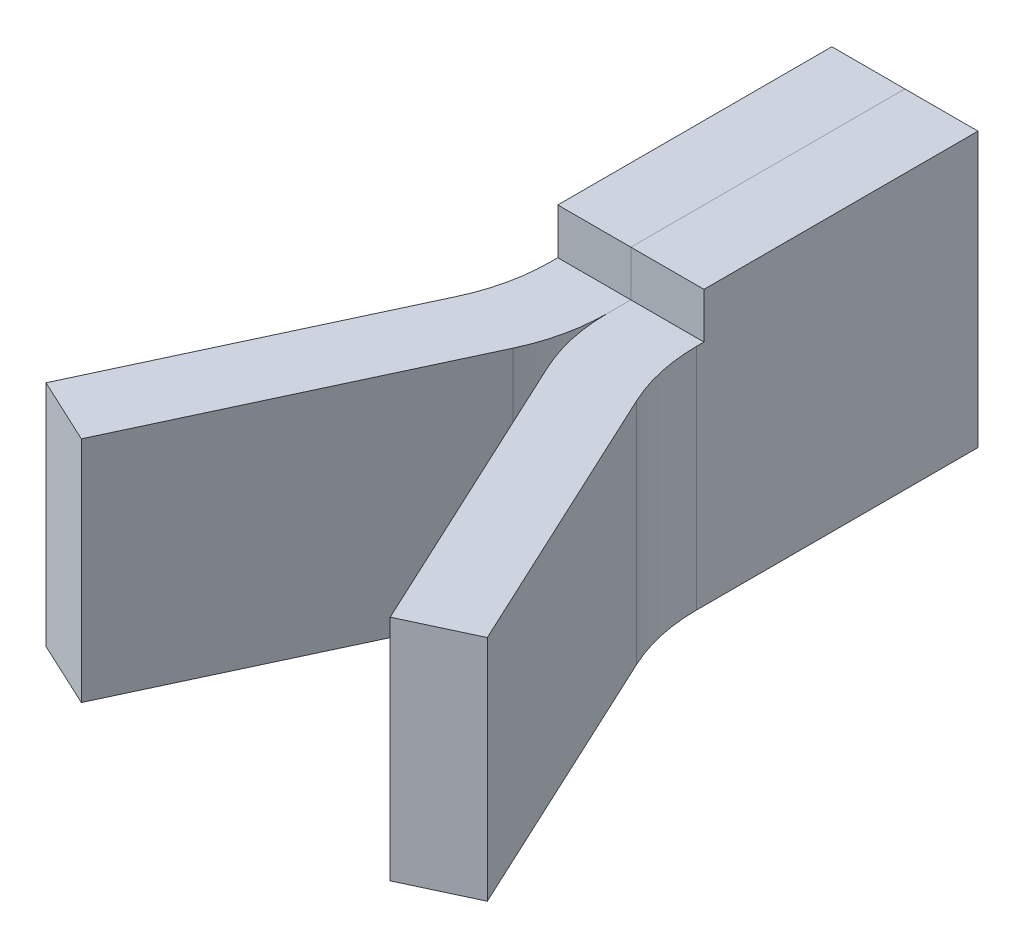
ISO-10303-21;
HEADER;
FILE_DESCRIPTION(('STEP AP214'),'2;1');
FILE_NAME('part.step','',(''),(''),'','','');
FILE_SCHEMA(('AUTOMOTIVE_DESIGN { 1 0 10303 214 1 1 1 1 }'));
ENDSEC;
DATA;
#1=APPLICATION_CONTEXT('core data for automotive mechanical design processes');
#2=APPLICATION_PROTOCOL_DEFINITION('international standard','automotive_design',2000,#1);
#3=PRODUCT_CONTEXT('',#1,'mechanical');
#4=PRODUCT('Part','Part','',(#3));
#5=PRODUCT_RELATED_PRODUCT_CATEGORY('part','',(#4));
#6=PRODUCT_DEFINITION_FORMATION('','',#4);
#7=PRODUCT_DEFINITION_CONTEXT('part definition',#1,'design');
#8=PRODUCT_DEFINITION('design','',#6,#7);
#9=PRODUCT_DEFINITION_SHAPE('','',#8);
#10=(LENGTH_UNIT() NAMED_UNIT(*) SI_UNIT(.MILLI.,.METRE.));
#11=(NAMED_UNIT(*) PLANE_ANGLE_UNIT() SI_UNIT($,.RADIAN.));
#12=(NAMED_UNIT(*) SI_UNIT($,.STERADIAN.) SOLID_ANGLE_UNIT());
#13=UNCERTAINTY_MEASURE_WITH_UNIT(LENGTH_MEASURE(1.E-05),#10,'distance_accuracy_value','');
#14=(GEOMETRIC_REPRESENTATION_CONTEXT(3) GLOBAL_UNCERTAINTY_ASSIGNED_CONTEXT((#13)) GLOBAL_UNIT_ASSIGNED_CONTEXT((#10,
#11,#12)) REPRESENTATION_CONTEXT('',''));
#15=CARTESIAN_POINT('',(0.,0.,0.));
#16=DIRECTION('',(0.,0.,1.));
#17=DIRECTION('',(1.,0.,0.));
#18=AXIS2_PLACEMENT_3D('',#15,#16,#17);
#19=CARTESIAN_POINT('',(-16.904730469628,25.,36.252311481466));
#20=DIRECTION('',(-0.906307787036649,0.,-0.422618261740701));
#21=DIRECTION('',(0.422618261740701,0.,-0.906307787036649));
#22=AXIS2_PLACEMENT_3D('',#19,#20,#21);
#23=PLANE('',#22);
#24=DIRECTION('',(-0.422618261740701,0.,0.906307787036649));
#25=VECTOR('',#24,1.);
#26=CARTESIAN_POINT('',(-16.904730469628,25.,36.252311481466));
#27=LINE('',#26,#25);
#28=CARTESIAN_POINT('',(-1.87384425926702,25.,4.01847198195521));
#29=VERTEX_POINT('',#28);
#30=CARTESIAN_POINT('',(-16.904730469628,25.,36.252311481466));
#31=VERTEX_POINT('',#30);
#32=EDGE_CURVE('E160',#29,#31,#27,.T.);
#33=ORIENTED_EDGE('',*,*,#32,.T.);
#34=DIRECTION('',(0.,-1.,0.));
#35=VECTOR('',#34,1.);
#36=CARTESIAN_POINT('',(-16.904730469628,25.,36.252311481466));
#37=LINE('',#36,#35);
#38=CARTESIAN_POINT('',(-16.904730469628,0.,36.252311481466));
#39=VERTEX_POINT('',#38);
#40=EDGE_CURVE('E191',#31,#39,#37,.T.);
#41=ORIENTED_EDGE('',*,*,#40,.T.);
#42=DIRECTION('',(-0.422618261740701,0.,0.906307787036649));
#43=VECTOR('',#42,1.);
#44=CARTESIAN_POINT('',(-16.904730469628,0.,36.252311481466));
#45=LINE('',#44,#43);
#46=CARTESIAN_POINT('',(-1.87384425926702,0.,4.01847198195521));
#47=VERTEX_POINT('',#46);
#48=EDGE_CURVE('E159',#47,#39,#45,.T.);
#49=ORIENTED_EDGE('',*,*,#48,.F.);
#50=DIRECTION('',(0.,-1.,0.));
#51=VECTOR('',#50,1.);
#52=CARTESIAN_POINT('',(-1.87384425926701,25.,4.01847198195521));
#53=LINE('',#52,#51);
#54=EDGE_CURVE('E194',#29,#47,#53,.T.);
#55=ORIENTED_EDGE('',*,*,#54,.F.);
#56=EDGE_LOOP('',(#33,#41,#49,#55));
#57=FACE_BOUND('',#56,.T.);
#58=ADVANCED_FACE('F47',(#57),#23,.F.);
#59=CARTESIAN_POINT('',(-24.1551927659212,25.,32.8713653875404));
#60=DIRECTION('',(0.422618261740701,0.,-0.906307787036649));
#61=DIRECTION('',(0.906307787036649,0.,0.422618261740701));
#62=AXIS2_PLACEMENT_3D('',#59,#60,#61);
#63=PLANE('',#62);
#64=DIRECTION('',(-0.906307787036649,0.,-0.422618261740701));
#65=VECTOR('',#64,1.);
#66=CARTESIAN_POINT('',(-24.1551927659212,0.,32.8713653875404));
#67=LINE('',#66,#65);
#68=CARTESIAN_POINT('',(-24.1551927659212,0.,32.8713653875404));
#69=VERTEX_POINT('',#68);
#70=EDGE_CURVE('E177',#39,#69,#67,.T.);
#71=ORIENTED_EDGE('',*,*,#70,.F.);
#72=ORIENTED_EDGE('',*,*,#40,.F.);
#73=DIRECTION('',(-0.906307787036649,0.,-0.422618261740701));
#74=VECTOR('',#73,1.);
#75=CARTESIAN_POINT('',(-24.1551927659212,25.,32.8713653875404));
#76=LINE('',#75,#74);
#77=CARTESIAN_POINT('',(-24.1551927659212,25.,32.8713653875404));
#78=VERTEX_POINT('',#77);
#79=EDGE_CURVE('E163',#31,#78,#76,.T.);
#80=ORIENTED_EDGE('',*,*,#79,.T.);
#81=DIRECTION('',(0.,-1.,0.));
#82=VECTOR('',#81,1.);
#83=CARTESIAN_POINT('',(-24.1551927659212,25.,32.8713653875404));
#84=LINE('',#83,#82);
#85=EDGE_CURVE('E141',#78,#69,#84,.T.);
#86=ORIENTED_EDGE('',*,*,#85,.T.);
#87=EDGE_LOOP('',(#71,#72,#80,#86));
#88=FACE_BOUND('',#87,.T.);
#89=ADVANCED_FACE('F216',(#88),#63,.F.);
#90=CARTESIAN_POINT('',(-8.,25.,-1.77355730114351));
#91=DIRECTION('',(0.906307787036649,0.,0.422618261740701));
#92=DIRECTION('',(-0.422618261740701,0.,0.906307787036649));
#93=AXIS2_PLACEMENT_3D('',#90,#91,#92);
#94=PLANE('',#93);
#95=DIRECTION('',(0.422618261740701,0.,-0.906307787036649));
#96=VECTOR('',#95,1.);
#97=CARTESIAN_POINT('',(-8.,0.,-1.77355730114351));
#98=LINE('',#97,#96);
#99=CARTESIAN_POINT('',(-9.87384425926702,0.,2.24491468081169));
#100=VERTEX_POINT('',#99);
#101=EDGE_CURVE('E180',#69,#100,#98,.T.);
#102=ORIENTED_EDGE('',*,*,#101,.F.);
#103=ORIENTED_EDGE('',*,*,#85,.F.);
#104=DIRECTION('',(0.422618261740701,0.,-0.906307787036649));
#105=VECTOR('',#104,1.);
#106=CARTESIAN_POINT('',(-8.,25.,-1.77355730114351));
#107=LINE('',#106,#105);
#108=CARTESIAN_POINT('',(-9.87384425926702,25.,2.24491468081169));
#109=VERTEX_POINT('',#108);
#110=EDGE_CURVE('E167',#78,#109,#107,.T.);
#111=ORIENTED_EDGE('',*,*,#110,.T.);
#112=DIRECTION('',(0.,-1.,0.));
#113=VECTOR('',#112,1.);
#114=CARTESIAN_POINT('',(-9.87384425926702,25.,2.24491468081169));
#115=LINE('',#114,#113);
#116=EDGE_CURVE('E206',#100,#109,#115,.F.);
#117=ORIENTED_EDGE('',*,*,#116,.F.);
#118=EDGE_LOOP('',(#102,#103,#111,#117));
#119=FACE_BOUND('',#118,.T.);
#120=ADVANCED_FACE('F210',(#119),#94,.F.);
#121=CARTESIAN_POINT('',(-8.,25.,-37.));
#122=DIRECTION('',(1.,0.,0.));
#123=DIRECTION('',(0.,0.,1.));
#124=AXIS2_PLACEMENT_3D('',#121,#122,#123);
#125=PLANE('',#124);
#126=DIRECTION('',(0.,0.,-1.));
#127=VECTOR('',#126,1.);
#128=CARTESIAN_POINT('',(-8.,25.,-37.));
#129=LINE('',#128,#127);
#130=CARTESIAN_POINT('',(-8.,25.,-6.20745055400233));
#131=VERTEX_POINT('',#130);
#132=CARTESIAN_POINT('',(-8.00000000000002,25.,-7.));
#133=VERTEX_POINT('',#132);
#134=EDGE_CURVE('E170',#131,#133,#129,.T.);
#135=ORIENTED_EDGE('',*,*,#134,.T.);
#136=DIRECTION('',(0.,-1.,0.));
#137=VECTOR('',#136,1.);
#138=CARTESIAN_POINT('',(-8.00000000000002,30.,-7.));
#139=LINE('',#138,#137);
#140=CARTESIAN_POINT('',(-8.00000000000002,30.,-7.));
#141=VERTEX_POINT('',#140);
#142=EDGE_CURVE('E147',#141,#133,#139,.T.);
#143=ORIENTED_EDGE('',*,*,#142,.F.);
#144=DIRECTION('',(0.,0.,-1.));
#145=VECTOR('',#144,1.);
#146=CARTESIAN_POINT('',(-8.,30.,-37.));
#147=LINE('',#146,#145);
#148=CARTESIAN_POINT('',(-8.,30.,-37.));
#149=VERTEX_POINT('',#148);
#150=EDGE_CURVE('E125',#141,#149,#147,.T.);
#151=ORIENTED_EDGE('',*,*,#150,.T.);
#152=DIRECTION('',(0.,-1.,0.));
#153=VECTOR('',#152,1.);
#154=CARTESIAN_POINT('',(-8.,25.,-37.));
#155=LINE('',#154,#153);
#156=CARTESIAN_POINT('',(-8.,0.,-37.));
#157=VERTEX_POINT('',#156);
#158=EDGE_CURVE('E134',#149,#157,#155,.T.);
#159=ORIENTED_EDGE('',*,*,#158,.T.);
#160=DIRECTION('',(0.,0.,-1.));
#161=VECTOR('',#160,1.);
#162=CARTESIAN_POINT('',(-8.,0.,-37.));
#163=LINE('',#162,#161);
#164=CARTESIAN_POINT('',(-8.,0.,-6.20745055400233));
#165=VERTEX_POINT('',#164);
#166=EDGE_CURVE('E183',#165,#157,#163,.T.);
#167=ORIENTED_EDGE('',*,*,#166,.F.);
#168=DIRECTION('',(0.,-1.,0.));
#169=VECTOR('',#168,1.);
#170=CARTESIAN_POINT('',(-8.,0.,-6.20745055400233));
#171=LINE('',#170,#169);
#172=EDGE_CURVE('E204',#131,#165,#171,.T.);
#173=ORIENTED_EDGE('',*,*,#172,.F.);
#174=EDGE_LOOP('',(#135,#143,#151,#159,#167,#173));
#175=FACE_BOUND('',#174,.T.);
#176=ADVANCED_FACE('F145',(#175),#125,.F.);
#177=CARTESIAN_POINT('',(0.,25.,-37.));
#178=DIRECTION('',(0.,0.,1.));
#179=DIRECTION('',(-1.,0.,0.));
#180=AXIS2_PLACEMENT_3D('',#177,#178,#179);
#181=PLANE('',#180);
#182=DIRECTION('',(1.,0.,0.));
#183=VECTOR('',#182,1.);
#184=CARTESIAN_POINT('',(0.,0.,-37.));
#185=LINE('',#184,#183);
#186=CARTESIAN_POINT('',(0.,0.,-37.));
#187=VERTEX_POINT('',#186);
#188=EDGE_CURVE('E137',#157,#187,#185,.T.);
#189=ORIENTED_EDGE('',*,*,#188,.F.);
#190=ORIENTED_EDGE('',*,*,#158,.F.);
#191=DIRECTION('',(1.,0.,0.));
#192=VECTOR('',#191,1.);
#193=CARTESIAN_POINT('',(-8.,30.,-37.));
#194=LINE('',#193,#192);
#195=CARTESIAN_POINT('',(0.,30.,-37.));
#196=VERTEX_POINT('',#195);
#197=EDGE_CURVE('E121',#149,#196,#194,.T.);
#198=ORIENTED_EDGE('',*,*,#197,.T.);
#199=DIRECTION('',(0.,-1.,0.));
#200=VECTOR('',#199,1.);
#201=CARTESIAN_POINT('',(0.,25.,-37.));
#202=LINE('',#201,#200);
#203=EDGE_CURVE('E142',#196,#187,#202,.T.);
#204=ORIENTED_EDGE('',*,*,#203,.T.);
#205=EDGE_LOOP('',(#189,#190,#198,#204));
#206=FACE_BOUND('',#205,.T.);
#207=ADVANCED_FACE('F135',(#206),#181,.F.);
#208=CARTESIAN_POINT('',(0.,25.,0.));
#209=DIRECTION('',(-1.,0.,0.));
#210=DIRECTION('',(0.,0.,-1.));
#211=AXIS2_PLACEMENT_3D('',#208,#209,#210);
#212=PLANE('',#211);
#213=DIRECTION('',(0.,0.,1.));
#214=VECTOR('',#213,1.);
#215=CARTESIAN_POINT('',(0.,0.,0.));
#216=LINE('',#215,#214);
#217=CARTESIAN_POINT('',(0.,0.,-4.43389325285881));
#218=VERTEX_POINT('',#217);
#219=EDGE_CURVE('E164',#187,#218,#216,.T.);
#220=ORIENTED_EDGE('',*,*,#219,.F.);
#221=ORIENTED_EDGE('',*,*,#203,.F.);
#222=DIRECTION('',(0.,0.,1.));
#223=VECTOR('',#222,1.);
#224=CARTESIAN_POINT('',(0.,30.,-37.));
#225=LINE('',#224,#223);
#226=CARTESIAN_POINT('',(0.,30.,-7.));
#227=VERTEX_POINT('',#226);
#228=EDGE_CURVE('E128',#196,#227,#225,.T.);
#229=ORIENTED_EDGE('',*,*,#228,.T.);
#230=DIRECTION('',(0.,-1.,0.));
#231=VECTOR('',#230,1.);
#232=CARTESIAN_POINT('',(0.,30.,-7.));
#233=LINE('',#232,#231);
#234=CARTESIAN_POINT('',(0.,25.,-7.));
#235=VERTEX_POINT('',#234);
#236=EDGE_CURVE('E156',#227,#235,#233,.T.);
#237=ORIENTED_EDGE('',*,*,#236,.T.);
#238=DIRECTION('',(0.,0.,1.));
#239=VECTOR('',#238,1.);
#240=CARTESIAN_POINT('',(0.,25.,0.));
#241=LINE('',#240,#239);
#242=CARTESIAN_POINT('',(0.,25.,-4.43389325285881));
#243=VERTEX_POINT('',#242);
#244=EDGE_CURVE('E172',#235,#243,#241,.T.);
#245=ORIENTED_EDGE('',*,*,#244,.T.);
#246=DIRECTION('',(0.,-1.,0.));
#247=VECTOR('',#246,1.);
#248=CARTESIAN_POINT('',(0.,25.,-4.43389325285881));
#249=LINE('',#248,#247);
#250=EDGE_CURVE('E199',#218,#243,#249,.F.);
#251=ORIENTED_EDGE('',*,*,#250,.F.);
#252=EDGE_LOOP('',(#220,#221,#229,#237,#245,#251));
#253=FACE_BOUND('',#252,.T.);
#254=ADVANCED_FACE('F226',(#253),#212,.F.);
#255=CARTESIAN_POINT('',(0.,25.,0.));
#256=DIRECTION('',(0.,1.,0.));
#257=DIRECTION('',(0.,0.,1.));
#258=AXIS2_PLACEMENT_3D('',#255,#256,#257);
#259=PLANE('',#258);
#260=ORIENTED_EDGE('',*,*,#244,.F.);
#261=DIRECTION('',(-1.,0.,0.));
#262=VECTOR('',#261,1.);
#263=CARTESIAN_POINT('',(-8.00000000000002,25.,-7.));
#264=LINE('',#263,#262);
#265=EDGE_CURVE('E148',#235,#133,#264,.T.);
#266=ORIENTED_EDGE('',*,*,#265,.T.);
#267=ORIENTED_EDGE('',*,*,#134,.F.);
#268=CARTESIAN_POINT('',(-28.,25.,-6.20745055400233));
#269=DIRECTION('',(0.,-1.,0.));
#270=DIRECTION('',(0.,0.,1.));
#271=AXIS2_PLACEMENT_3D('',#268,#269,#270);
#272=CIRCLE('',#271,20.);
#273=EDGE_CURVE('E12',#109,#131,#272,.F.);
#274=ORIENTED_EDGE('',*,*,#273,.F.);
#275=ORIENTED_EDGE('',*,*,#110,.F.);
#276=ORIENTED_EDGE('',*,*,#79,.F.);
#277=ORIENTED_EDGE('',*,*,#32,.F.);
#278=CARTESIAN_POINT('',(-20.,25.,-4.43389325285881));
#279=DIRECTION('',(0.,-1.,0.));
#280=DIRECTION('',(0.,0.,1.));
#281=AXIS2_PLACEMENT_3D('',#278,#279,#280);
#282=CIRCLE('',#281,20.);
#283=EDGE_CURVE('E202',#243,#29,#282,.T.);
#284=ORIENTED_EDGE('',*,*,#283,.F.);
#285=EDGE_LOOP('',(#260,#266,#267,#274,#275,#276,#277,#284));
#286=FACE_BOUND('',#285,.T.);
#287=ADVANCED_FACE('F219',(#286),#259,.T.);
#288=CARTESIAN_POINT('',(0.,0.,0.));
#289=DIRECTION('',(0.,1.,0.));
#290=DIRECTION('',(0.,0.,1.));
#291=AXIS2_PLACEMENT_3D('',#288,#289,#290);
#292=PLANE('',#291);
#293=ORIENTED_EDGE('',*,*,#48,.T.);
#294=ORIENTED_EDGE('',*,*,#70,.T.);
#295=ORIENTED_EDGE('',*,*,#101,.T.);
#296=CARTESIAN_POINT('',(-28.,0.,-6.20745055400233));
#297=DIRECTION('',(0.,-1.,0.));
#298=DIRECTION('',(0.,0.,1.));
#299=AXIS2_PLACEMENT_3D('',#296,#297,#298);
#300=CIRCLE('',#299,20.);
#301=EDGE_CURVE('E55',#165,#100,#300,.T.);
#302=ORIENTED_EDGE('',*,*,#301,.F.);
#303=ORIENTED_EDGE('',*,*,#166,.T.);
#304=ORIENTED_EDGE('',*,*,#188,.T.);
#305=ORIENTED_EDGE('',*,*,#219,.T.);
#306=CARTESIAN_POINT('',(-20.,0.,-4.43389325285881));
#307=DIRECTION('',(0.,-1.,0.));
#308=DIRECTION('',(0.,0.,1.));
#309=AXIS2_PLACEMENT_3D('',#306,#307,#308);
#310=CIRCLE('',#309,20.);
#311=EDGE_CURVE('E197',#47,#218,#310,.F.);
#312=ORIENTED_EDGE('',*,*,#311,.F.);
#313=EDGE_LOOP('',(#293,#294,#295,#302,#303,#304,#305,#312));
#314=FACE_BOUND('',#313,.T.);
#315=ADVANCED_FACE('F212',(#314),#292,.F.);
#316=CARTESIAN_POINT('',(-8.00000000000002,30.,-7.));
#317=DIRECTION('',(0.,0.,-1.));
#318=DIRECTION('',(1.,0.,0.));
#319=AXIS2_PLACEMENT_3D('',#316,#317,#318);
#320=PLANE('',#319);
#321=ORIENTED_EDGE('',*,*,#265,.F.);
#322=ORIENTED_EDGE('',*,*,#236,.F.);
#323=DIRECTION('',(-1.,0.,0.));
#324=VECTOR('',#323,1.);
#325=CARTESIAN_POINT('',(-8.00000000000002,30.,-7.));
#326=LINE('',#325,#324);
#327=EDGE_CURVE('E153',#227,#141,#326,.T.);
#328=ORIENTED_EDGE('',*,*,#327,.T.);
#329=ORIENTED_EDGE('',*,*,#142,.T.);
#330=EDGE_LOOP('',(#321,#322,#328,#329));
#331=FACE_BOUND('',#330,.T.);
#332=ADVANCED_FACE('F229',(#331),#320,.F.);
#333=CARTESIAN_POINT('',(0.,30.,0.));
#334=DIRECTION('',(0.,-1.,0.));
#335=DIRECTION('',(0.,0.,-1.));
#336=AXIS2_PLACEMENT_3D('',#333,#334,#335);
#337=PLANE('',#336);
#338=ORIENTED_EDGE('',*,*,#150,.F.);
#339=ORIENTED_EDGE('',*,*,#327,.F.);
#340=ORIENTED_EDGE('',*,*,#228,.F.);
#341=ORIENTED_EDGE('',*,*,#197,.F.);
#342=EDGE_LOOP('',(#338,#339,#340,#341));
#343=FACE_BOUND('',#342,.T.);
#344=ADVANCED_FACE('F123',(#343),#337,.F.);
#345=CARTESIAN_POINT('',(-20.,25.,-4.43389325285881));
#346=DIRECTION('',(0.,-1.,0.));
#347=DIRECTION('',(0.,0.,-1.));
#348=AXIS2_PLACEMENT_3D('',#345,#346,#347);
#349=CYLINDRICAL_SURFACE('',#348,20.);
#350=ORIENTED_EDGE('',*,*,#283,.T.);
#351=ORIENTED_EDGE('',*,*,#54,.T.);
#352=ORIENTED_EDGE('',*,*,#311,.T.);
#353=ORIENTED_EDGE('',*,*,#250,.T.);
#354=EDGE_LOOP('',(#350,#351,#352,#353));
#355=FACE_BOUND('',#354,.T.);
#356=ADVANCED_FACE('F223',(#355),#349,.T.);
#357=CARTESIAN_POINT('',(-28.,25.,-6.20745055400233));
#358=DIRECTION('',(0.,1.,0.));
#359=DIRECTION('',(0.,0.,1.));
#360=AXIS2_PLACEMENT_3D('',#357,#358,#359);
#361=CYLINDRICAL_SURFACE('',#360,20.);
#362=ORIENTED_EDGE('',*,*,#273,.T.);
#363=ORIENTED_EDGE('',*,*,#172,.T.);
#364=ORIENTED_EDGE('',*,*,#301,.T.);
#365=ORIENTED_EDGE('',*,*,#116,.T.);
#366=EDGE_LOOP('',(#362,#363,#364,#365));
#367=FACE_BOUND('',#366,.T.);
#368=ADVANCED_FACE('F49',(#367),#361,.F.);
#369=CLOSED_SHELL('',(#58,#89,#120,#176,#207,#254,#287,#315,#332,#344,#356,#368));
#370=MANIFOLD_SOLID_BREP('B2',#369);
#371=CARTESIAN_POINT('',(16.904730469628,25.,36.252311481466));
#372=DIRECTION('',(0.906307787036649,0.,-0.422618261740701));
#373=DIRECTION('',(-0.422618261740701,0.,-0.906307787036649));
#374=AXIS2_PLACEMENT_3D('',#371,#372,#373);
#375=PLANE('',#374);
#376=DIRECTION('',(0.422618261740701,0.,0.906307787036649));
#377=VECTOR('',#376,1.);
#378=CARTESIAN_POINT('',(16.904730469628,25.,36.252311481466));
#379=LINE('',#378,#377);
#380=CARTESIAN_POINT('',(1.87384425926702,25.,4.01847198195521));
#381=VERTEX_POINT('',#380);
#382=CARTESIAN_POINT('',(16.904730469628,25.,36.252311481466));
#383=VERTEX_POINT('',#382);
#384=EDGE_CURVE('E452',#381,#383,#379,.T.);
#385=ORIENTED_EDGE('',*,*,#384,.F.);
#386=DIRECTION('',(0.,-1.,0.));
#387=VECTOR('',#386,1.);
#388=CARTESIAN_POINT('',(1.87384425926701,25.,4.01847198195521));
#389=LINE('',#388,#387);
#390=CARTESIAN_POINT('',(1.87384425926702,0.,4.01847198195521));
#391=VERTEX_POINT('',#390);
#392=EDGE_CURVE('E480',#381,#391,#389,.T.);
#393=ORIENTED_EDGE('',*,*,#392,.T.);
#394=DIRECTION('',(0.422618261740701,0.,0.906307787036649));
#395=VECTOR('',#394,1.);
#396=CARTESIAN_POINT('',(16.904730469628,0.,36.252311481466));
#397=LINE('',#396,#395);
#398=CARTESIAN_POINT('',(16.904730469628,0.,36.252311481466));
#399=VERTEX_POINT('',#398);
#400=EDGE_CURVE('E451',#391,#399,#397,.T.);
#401=ORIENTED_EDGE('',*,*,#400,.T.);
#402=DIRECTION('',(0.,-1.,0.));
#403=VECTOR('',#402,1.);
#404=CARTESIAN_POINT('',(16.904730469628,25.,36.252311481466));
#405=LINE('',#404,#403);
#406=EDGE_CURVE('E477',#383,#399,#405,.T.);
#407=ORIENTED_EDGE('',*,*,#406,.F.);
#408=EDGE_LOOP('',(#385,#393,#401,#407));
#409=FACE_BOUND('',#408,.T.);
#410=ADVANCED_FACE('F336',(#409),#375,.F.);
#411=CARTESIAN_POINT('',(24.1551927659212,25.,32.8713653875404));
#412=DIRECTION('',(-0.422618261740701,0.,-0.906307787036649));
#413=DIRECTION('',(-0.906307787036649,0.,0.422618261740701));
#414=AXIS2_PLACEMENT_3D('',#411,#412,#413);
#415=PLANE('',#414);
#416=DIRECTION('',(0.906307787036649,0.,-0.422618261740701));
#417=VECTOR('',#416,1.);
#418=CARTESIAN_POINT('',(24.1551927659212,0.,32.8713653875404));
#419=LINE('',#418,#417);
#420=CARTESIAN_POINT('',(24.1551927659212,0.,32.8713653875404));
#421=VERTEX_POINT('',#420);
#422=EDGE_CURVE('E465',#399,#421,#419,.T.);
#423=ORIENTED_EDGE('',*,*,#422,.T.);
#424=DIRECTION('',(0.,-1.,0.));
#425=VECTOR('',#424,1.);
#426=CARTESIAN_POINT('',(24.1551927659212,25.,32.8713653875404));
#427=LINE('',#426,#425);
#428=CARTESIAN_POINT('',(24.1551927659212,25.,32.8713653875404));
#429=VERTEX_POINT('',#428);
#430=EDGE_CURVE('E424',#429,#421,#427,.T.);
#431=ORIENTED_EDGE('',*,*,#430,.F.);
#432=DIRECTION('',(0.906307787036649,0.,-0.422618261740701));
#433=VECTOR('',#432,1.);
#434=CARTESIAN_POINT('',(24.1551927659212,25.,32.8713653875404));
#435=LINE('',#434,#433);
#436=EDGE_CURVE('E454',#383,#429,#435,.T.);
#437=ORIENTED_EDGE('',*,*,#436,.F.);
#438=ORIENTED_EDGE('',*,*,#406,.T.);
#439=EDGE_LOOP('',(#423,#431,#437,#438));
#440=FACE_BOUND('',#439,.T.);
#441=ADVANCED_FACE('F518',(#440),#415,.F.);
#442=CARTESIAN_POINT('',(8.,25.,-1.77355730114351));
#443=DIRECTION('',(-0.906307787036649,0.,0.422618261740701));
#444=DIRECTION('',(0.422618261740701,0.,0.906307787036649));
#445=AXIS2_PLACEMENT_3D('',#442,#443,#444);
#446=PLANE('',#445);
#447=DIRECTION('',(-0.422618261740701,0.,-0.906307787036649));
#448=VECTOR('',#447,1.);
#449=CARTESIAN_POINT('',(8.,0.,-1.77355730114351));
#450=LINE('',#449,#448);
#451=CARTESIAN_POINT('',(9.87384425926702,0.,2.24491468081169));
#452=VERTEX_POINT('',#451);
#453=EDGE_CURVE('E467',#421,#452,#450,.T.);
#454=ORIENTED_EDGE('',*,*,#453,.T.);
#455=DIRECTION('',(0.,-1.,0.));
#456=VECTOR('',#455,1.);
#457=CARTESIAN_POINT('',(9.87384425926702,25.,2.24491468081169));
#458=LINE('',#457,#456);
#459=CARTESIAN_POINT('',(9.87384425926702,25.,2.24491468081169));
#460=VERTEX_POINT('',#459);
#461=EDGE_CURVE('E357',#452,#460,#458,.F.);
#462=ORIENTED_EDGE('',*,*,#461,.T.);
#463=DIRECTION('',(-0.422618261740701,0.,-0.906307787036649));
#464=VECTOR('',#463,1.);
#465=CARTESIAN_POINT('',(8.,25.,-1.77355730114351));
#466=LINE('',#465,#464);
#467=EDGE_CURVE('E457',#429,#460,#466,.T.);
#468=ORIENTED_EDGE('',*,*,#467,.F.);
#469=ORIENTED_EDGE('',*,*,#430,.T.);
#470=EDGE_LOOP('',(#454,#462,#468,#469));
#471=FACE_BOUND('',#470,.T.);
#472=ADVANCED_FACE('F498',(#471),#446,.F.);
#473=CARTESIAN_POINT('',(8.,25.,-37.));
#474=DIRECTION('',(-1.,0.,0.));
#475=DIRECTION('',(0.,0.,1.));
#476=AXIS2_PLACEMENT_3D('',#473,#474,#475);
#477=PLANE('',#476);
#478=DIRECTION('',(0.,0.,-1.));
#479=VECTOR('',#478,1.);
#480=CARTESIAN_POINT('',(8.,25.,-37.));
#481=LINE('',#480,#479);
#482=CARTESIAN_POINT('',(8.,25.,-6.20745055400233));
#483=VERTEX_POINT('',#482);
#484=CARTESIAN_POINT('',(8.00000000000002,25.,-7.));
#485=VERTEX_POINT('',#484);
#486=EDGE_CURVE('E459',#483,#485,#481,.T.);
#487=ORIENTED_EDGE('',*,*,#486,.F.);
#488=DIRECTION('',(0.,-1.,0.));
#489=VECTOR('',#488,1.);
#490=CARTESIAN_POINT('',(8.,0.,-6.20745055400233));
#491=LINE('',#490,#489);
#492=CARTESIAN_POINT('',(8.,0.,-6.20745055400233));
#493=VERTEX_POINT('',#492);
#494=EDGE_CURVE('E489',#483,#493,#491,.T.);
#495=ORIENTED_EDGE('',*,*,#494,.T.);
#496=DIRECTION('',(0.,0.,-1.));
#497=VECTOR('',#496,1.);
#498=CARTESIAN_POINT('',(8.,0.,-37.));
#499=LINE('',#498,#497);
#500=CARTESIAN_POINT('',(8.,0.,-37.));
#501=VERTEX_POINT('',#500);
#502=EDGE_CURVE('E421',#493,#501,#499,.T.);
#503=ORIENTED_EDGE('',*,*,#502,.T.);
#504=DIRECTION('',(0.,-1.,0.));
#505=VECTOR('',#504,1.);
#506=CARTESIAN_POINT('',(8.,25.,-37.));
#507=LINE('',#506,#505);
#508=CARTESIAN_POINT('',(8.,30.,-37.));
#509=VERTEX_POINT('',#508);
#510=EDGE_CURVE('E413',#509,#501,#507,.T.);
#511=ORIENTED_EDGE('',*,*,#510,.F.);
#512=DIRECTION('',(0.,0.,-1.));
#513=VECTOR('',#512,1.);
#514=CARTESIAN_POINT('',(8.,30.,-37.));
#515=LINE('',#514,#513);
#516=CARTESIAN_POINT('',(8.00000000000002,30.,-7.));
#517=VERTEX_POINT('',#516);
#518=EDGE_CURVE('E418',#517,#509,#515,.T.);
#519=ORIENTED_EDGE('',*,*,#518,.F.);
#520=DIRECTION('',(0.,-1.,0.));
#521=VECTOR('',#520,1.);
#522=CARTESIAN_POINT('',(8.00000000000002,30.,-7.));
#523=LINE('',#522,#521);
#524=EDGE_CURVE('E445',#517,#485,#523,.T.);
#525=ORIENTED_EDGE('',*,*,#524,.T.);
#526=EDGE_LOOP('',(#487,#495,#503,#511,#519,#525));
#527=FACE_BOUND('',#526,.T.);
#528=ADVANCED_FACE('F415',(#527),#477,.F.);
#529=CARTESIAN_POINT('',(0.,25.,-37.));
#530=DIRECTION('',(0.,0.,1.));
#531=DIRECTION('',(1.,0.,0.));
#532=AXIS2_PLACEMENT_3D('',#529,#530,#531);
#533=PLANE('',#532);
#534=DIRECTION('',(-1.,0.,0.));
#535=VECTOR('',#534,1.);
#536=CARTESIAN_POINT('',(0.,0.,-37.));
#537=LINE('',#536,#535);
#538=CARTESIAN_POINT('',(0.,0.,-37.));
#539=VERTEX_POINT('',#538);
#540=EDGE_CURVE('E470',#501,#539,#537,.T.);
#541=ORIENTED_EDGE('',*,*,#540,.T.);
#542=DIRECTION('',(0.,-1.,0.));
#543=VECTOR('',#542,1.);
#544=CARTESIAN_POINT('',(0.,25.,-37.));
#545=LINE('',#544,#543);
#546=CARTESIAN_POINT('',(0.,30.,-37.));
#547=VERTEX_POINT('',#546);
#548=EDGE_CURVE('E425',#547,#539,#545,.T.);
#549=ORIENTED_EDGE('',*,*,#548,.F.);
#550=DIRECTION('',(-1.,0.,0.));
#551=VECTOR('',#550,1.);
#552=CARTESIAN_POINT('',(8.,30.,-37.));
#553=LINE('',#552,#551);
#554=EDGE_CURVE('E428',#509,#547,#553,.T.);
#555=ORIENTED_EDGE('',*,*,#554,.F.);
#556=ORIENTED_EDGE('',*,*,#510,.T.);
#557=EDGE_LOOP('',(#541,#549,#555,#556));
#558=FACE_BOUND('',#557,.T.);
#559=ADVANCED_FACE('F429',(#558),#533,.F.);
#560=CARTESIAN_POINT('',(0.,25.,0.));
#561=DIRECTION('',(1.,0.,0.));
#562=DIRECTION('',(0.,0.,-1.));
#563=AXIS2_PLACEMENT_3D('',#560,#561,#562);
#564=PLANE('',#563);
#565=DIRECTION('',(0.,0.,1.));
#566=VECTOR('',#565,1.);
#567=CARTESIAN_POINT('',(0.,0.,0.));
#568=LINE('',#567,#566);
#569=CARTESIAN_POINT('',(0.,0.,-4.43389325285881));
#570=VERTEX_POINT('',#569);
#571=EDGE_CURVE('E455',#539,#570,#568,.T.);
#572=ORIENTED_EDGE('',*,*,#571,.T.);
#573=DIRECTION('',(0.,-1.,0.));
#574=VECTOR('',#573,1.);
#575=CARTESIAN_POINT('',(0.,25.,-4.43389325285881));
#576=LINE('',#575,#574);
#577=CARTESIAN_POINT('',(0.,25.,-4.43389325285881));
#578=VERTEX_POINT('',#577);
#579=EDGE_CURVE('E485',#570,#578,#576,.F.);
#580=ORIENTED_EDGE('',*,*,#579,.T.);
#581=DIRECTION('',(0.,0.,1.));
#582=VECTOR('',#581,1.);
#583=CARTESIAN_POINT('',(0.,25.,0.));
#584=LINE('',#583,#582);
#585=CARTESIAN_POINT('',(0.,25.,-7.));
#586=VERTEX_POINT('',#585);
#587=EDGE_CURVE('E461',#586,#578,#584,.T.);
#588=ORIENTED_EDGE('',*,*,#587,.F.);
#589=DIRECTION('',(0.,-1.,0.));
#590=VECTOR('',#589,1.);
#591=CARTESIAN_POINT('',(0.,30.,-7.));
#592=LINE('',#591,#590);
#593=CARTESIAN_POINT('',(0.,30.,-7.));
#594=VERTEX_POINT('',#593);
#595=EDGE_CURVE('E448',#594,#586,#592,.T.);
#596=ORIENTED_EDGE('',*,*,#595,.F.);
#597=DIRECTION('',(0.,0.,1.));
#598=VECTOR('',#597,1.);
#599=CARTESIAN_POINT('',(0.,30.,-37.));
#600=LINE('',#599,#598);
#601=EDGE_CURVE('E433',#547,#594,#600,.T.);
#602=ORIENTED_EDGE('',*,*,#601,.F.);
#603=ORIENTED_EDGE('',*,*,#548,.T.);
#604=EDGE_LOOP('',(#572,#580,#588,#596,#602,#603));
#605=FACE_BOUND('',#604,.T.);
#606=ADVANCED_FACE('F506',(#605),#564,.F.);
#607=CARTESIAN_POINT('',(0.,25.,0.));
#608=DIRECTION('',(0.,1.,0.));
#609=DIRECTION('',(0.,0.,1.));
#610=AXIS2_PLACEMENT_3D('',#607,#608,#609);
#611=PLANE('',#610);
#612=ORIENTED_EDGE('',*,*,#587,.T.);
#613=CARTESIAN_POINT('',(20.,25.,-4.43389325285881));
#614=DIRECTION('',(0.,1.,0.));
#615=DIRECTION('',(0.,0.,1.));
#616=AXIS2_PLACEMENT_3D('',#613,#614,#615);
#617=CIRCLE('',#616,20.);
#618=EDGE_CURVE('E487',#578,#381,#617,.T.);
#619=ORIENTED_EDGE('',*,*,#618,.T.);
#620=ORIENTED_EDGE('',*,*,#384,.T.);
#621=ORIENTED_EDGE('',*,*,#436,.T.);
#622=ORIENTED_EDGE('',*,*,#467,.T.);
#623=CARTESIAN_POINT('',(28.,25.,-6.20745055400233));
#624=DIRECTION('',(0.,1.,0.));
#625=DIRECTION('',(0.,0.,1.));
#626=AXIS2_PLACEMENT_3D('',#623,#624,#625);
#627=CIRCLE('',#626,20.);
#628=EDGE_CURVE('E45',#460,#483,#627,.F.);
#629=ORIENTED_EDGE('',*,*,#628,.T.);
#630=ORIENTED_EDGE('',*,*,#486,.T.);
#631=DIRECTION('',(1.,0.,0.));
#632=VECTOR('',#631,1.);
#633=CARTESIAN_POINT('',(8.00000000000002,25.,-7.));
#634=LINE('',#633,#632);
#635=EDGE_CURVE('E439',#586,#485,#634,.T.);
#636=ORIENTED_EDGE('',*,*,#635,.F.);
#637=EDGE_LOOP('',(#612,#619,#620,#621,#622,#629,#630,#636));
#638=FACE_BOUND('',#637,.T.);
#639=ADVANCED_FACE('F500',(#638),#611,.T.);
#640=CARTESIAN_POINT('',(0.,0.,0.));
#641=DIRECTION('',(0.,1.,0.));
#642=DIRECTION('',(0.,0.,1.));
#643=AXIS2_PLACEMENT_3D('',#640,#641,#642);
#644=PLANE('',#643);
#645=ORIENTED_EDGE('',*,*,#400,.F.);
#646=CARTESIAN_POINT('',(20.,0.,-4.43389325285881));
#647=DIRECTION('',(0.,1.,0.));
#648=DIRECTION('',(0.,0.,1.));
#649=AXIS2_PLACEMENT_3D('',#646,#647,#648);
#650=CIRCLE('',#649,20.);
#651=EDGE_CURVE('E483',#391,#570,#650,.F.);
#652=ORIENTED_EDGE('',*,*,#651,.T.);
#653=ORIENTED_EDGE('',*,*,#571,.F.);
#654=ORIENTED_EDGE('',*,*,#540,.F.);
#655=ORIENTED_EDGE('',*,*,#502,.F.);
#656=CARTESIAN_POINT('',(28.,0.,-6.20745055400233));
#657=DIRECTION('',(0.,1.,0.));
#658=DIRECTION('',(0.,0.,1.));
#659=AXIS2_PLACEMENT_3D('',#656,#657,#658);
#660=CIRCLE('',#659,20.);
#661=EDGE_CURVE('E344',#493,#452,#660,.T.);
#662=ORIENTED_EDGE('',*,*,#661,.T.);
#663=ORIENTED_EDGE('',*,*,#453,.F.);
#664=ORIENTED_EDGE('',*,*,#422,.F.);
#665=EDGE_LOOP('',(#645,#652,#653,#654,#655,#662,#663,#664));
#666=FACE_BOUND('',#665,.T.);
#667=ADVANCED_FACE('F494',(#666),#644,.F.);
#668=CARTESIAN_POINT('',(8.00000000000002,30.,-7.));
#669=DIRECTION('',(0.,0.,-1.));
#670=DIRECTION('',(-1.,0.,0.));
#671=AXIS2_PLACEMENT_3D('',#668,#669,#670);
#672=PLANE('',#671);
#673=ORIENTED_EDGE('',*,*,#635,.T.);
#674=ORIENTED_EDGE('',*,*,#524,.F.);
#675=DIRECTION('',(1.,0.,0.));
#676=VECTOR('',#675,1.);
#677=CARTESIAN_POINT('',(8.00000000000002,30.,-7.));
#678=LINE('',#677,#676);
#679=EDGE_CURVE('E437',#594,#517,#678,.T.);
#680=ORIENTED_EDGE('',*,*,#679,.F.);
#681=ORIENTED_EDGE('',*,*,#595,.T.);
#682=EDGE_LOOP('',(#673,#674,#680,#681));
#683=FACE_BOUND('',#682,.T.);
#684=ADVANCED_FACE('F503',(#683),#672,.F.);
#685=CARTESIAN_POINT('',(0.,30.,0.));
#686=DIRECTION('',(0.,-1.,0.));
#687=DIRECTION('',(0.,0.,-1.));
#688=AXIS2_PLACEMENT_3D('',#685,#686,#687);
#689=PLANE('',#688);
#690=ORIENTED_EDGE('',*,*,#518,.T.);
#691=ORIENTED_EDGE('',*,*,#554,.T.);
#692=ORIENTED_EDGE('',*,*,#601,.T.);
#693=ORIENTED_EDGE('',*,*,#679,.T.);
#694=EDGE_LOOP('',(#690,#691,#692,#693));
#695=FACE_BOUND('',#694,.T.);
#696=ADVANCED_FACE('F435',(#695),#689,.F.);
#697=CARTESIAN_POINT('',(20.,25.,-4.43389325285881));
#698=DIRECTION('',(0.,-1.,0.));
#699=DIRECTION('',(0.,0.,-1.));
#700=AXIS2_PLACEMENT_3D('',#697,#698,#699);
#701=CYLINDRICAL_SURFACE('',#700,20.);
#702=ORIENTED_EDGE('',*,*,#618,.F.);
#703=ORIENTED_EDGE('',*,*,#579,.F.);
#704=ORIENTED_EDGE('',*,*,#651,.F.);
#705=ORIENTED_EDGE('',*,*,#392,.F.);
#706=EDGE_LOOP('',(#702,#703,#704,#705));
#707=FACE_BOUND('',#706,.T.);
#708=ADVANCED_FACE('F512',(#707),#701,.T.);
#709=CARTESIAN_POINT('',(28.,25.,-6.20745055400233));
#710=DIRECTION('',(0.,1.,0.));
#711=DIRECTION('',(0.,0.,1.));
#712=AXIS2_PLACEMENT_3D('',#709,#710,#711);
#713=CYLINDRICAL_SURFACE('',#712,20.);
#714=ORIENTED_EDGE('',*,*,#628,.F.);
#715=ORIENTED_EDGE('',*,*,#461,.F.);
#716=ORIENTED_EDGE('',*,*,#661,.F.);
#717=ORIENTED_EDGE('',*,*,#494,.F.);
#718=EDGE_LOOP('',(#714,#715,#716,#717));
#719=FACE_BOUND('',#718,.T.);
#720=ADVANCED_FACE('F338',(#719),#713,.F.);
#721=CLOSED_SHELL('',(#410,#441,#472,#528,#559,#606,#639,#667,#684,#696,#708,#720));
#722=MANIFOLD_SOLID_BREP('B6_NOT_SHOWN',#721);
#723=ADVANCED_BREP_SHAPE_REPRESENTATION('',(#18,#370,#722),#14);
#724=SHAPE_DEFINITION_REPRESENTATION(#9,#723);
ENDSEC;
END-ISO-10303-21;
